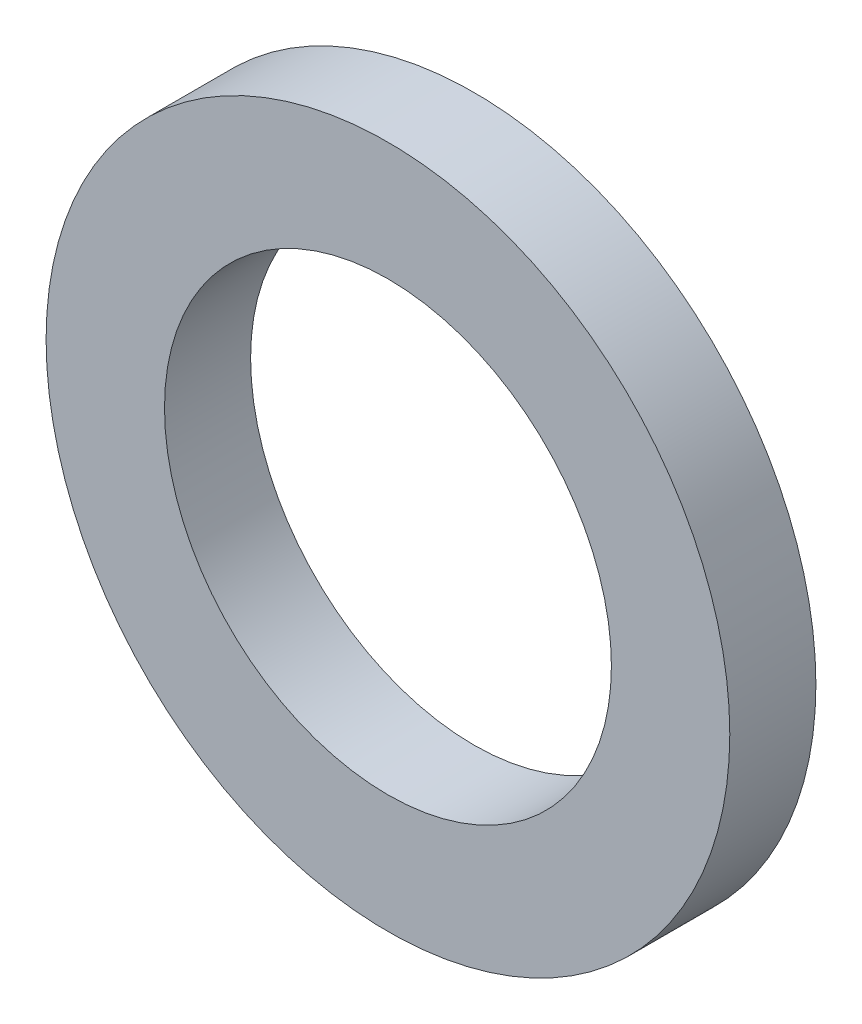
ISO-10303-21;
HEADER;
FILE_DESCRIPTION(('STEP AP214'),'2;1');
FILE_NAME('part.step','',(''),(''),'','','');
FILE_SCHEMA(('AUTOMOTIVE_DESIGN { 1 0 10303 214 1 1 1 1 }'));
ENDSEC;
DATA;
#1=APPLICATION_CONTEXT('core data for automotive mechanical design processes');
#2=APPLICATION_PROTOCOL_DEFINITION('international standard','automotive_design',2000,#1);
#3=PRODUCT_CONTEXT('',#1,'mechanical');
#4=PRODUCT('Part','Part','',(#3));
#5=PRODUCT_RELATED_PRODUCT_CATEGORY('part','',(#4));
#6=PRODUCT_DEFINITION_FORMATION('','',#4);
#7=PRODUCT_DEFINITION_CONTEXT('part definition',#1,'design');
#8=PRODUCT_DEFINITION('design','',#6,#7);
#9=PRODUCT_DEFINITION_SHAPE('','',#8);
#10=(LENGTH_UNIT() NAMED_UNIT(*) SI_UNIT(.MILLI.,.METRE.));
#11=(NAMED_UNIT(*) PLANE_ANGLE_UNIT() SI_UNIT($,.RADIAN.));
#12=(NAMED_UNIT(*) SI_UNIT($,.STERADIAN.) SOLID_ANGLE_UNIT());
#13=UNCERTAINTY_MEASURE_WITH_UNIT(LENGTH_MEASURE(1.E-05),#10,'distance_accuracy_value','');
#14=(GEOMETRIC_REPRESENTATION_CONTEXT(3) GLOBAL_UNCERTAINTY_ASSIGNED_CONTEXT((#13)) GLOBAL_UNIT_ASSIGNED_CONTEXT((#10,
#11,#12)) REPRESENTATION_CONTEXT('',''));
#15=CARTESIAN_POINT('',(0.,0.,0.));
#16=DIRECTION('',(0.,0.,1.));
#17=DIRECTION('',(1.,0.,0.));
#18=AXIS2_PLACEMENT_3D('',#15,#16,#17);
#19=CARTESIAN_POINT('',(0.,0.,2.));
#20=DIRECTION('',(0.,0.,1.));
#21=DIRECTION('',(1.,0.,0.));
#22=AXIS2_PLACEMENT_3D('',#19,#20,#21);
#23=PLANE('',#22);
#24=CARTESIAN_POINT('',(0.,0.,2.));
#25=DIRECTION('',(0.,0.,1.));
#26=DIRECTION('',(1.,0.,0.));
#27=AXIS2_PLACEMENT_3D('',#24,#25,#26);
#28=CIRCLE('',#27,7.94);
#29=CARTESIAN_POINT('',(7.94,0.,2.));
#30=VERTEX_POINT('',#29);
#31=EDGE_CURVE('E10',#30,#30,#28,.T.);
#32=ORIENTED_EDGE('',*,*,#31,.T.);
#33=EDGE_LOOP('',(#32));
#34=FACE_BOUND('',#33,.T.);
#35=CARTESIAN_POINT('',(0.,0.,2.));
#36=DIRECTION('',(0.,0.,1.));
#37=DIRECTION('',(1.,0.,0.));
#38=AXIS2_PLACEMENT_3D('',#35,#36,#37);
#39=CIRCLE('',#38,5.19);
#40=CARTESIAN_POINT('',(5.19,0.,2.));
#41=VERTEX_POINT('',#40);
#42=EDGE_CURVE('E54',#41,#41,#39,.T.);
#43=ORIENTED_EDGE('',*,*,#42,.F.);
#44=EDGE_LOOP('',(#43));
#45=FACE_BOUND('',#44,.T.);
#46=ADVANCED_FACE('F41',(#34,#45),#23,.T.);
#47=CARTESIAN_POINT('',(0.,0.,0.));
#48=DIRECTION('',(0.,0.,1.));
#49=DIRECTION('',(1.,0.,0.));
#50=AXIS2_PLACEMENT_3D('',#47,#48,#49);
#51=PLANE('',#50);
#52=CARTESIAN_POINT('',(0.,0.,0.));
#53=DIRECTION('',(0.,0.,1.));
#54=DIRECTION('',(1.,0.,0.));
#55=AXIS2_PLACEMENT_3D('',#52,#53,#54);
#56=CIRCLE('',#55,7.94);
#57=CARTESIAN_POINT('',(7.94,0.,0.));
#58=VERTEX_POINT('',#57);
#59=EDGE_CURVE('E45',#58,#58,#56,.T.);
#60=ORIENTED_EDGE('',*,*,#59,.F.);
#61=EDGE_LOOP('',(#60));
#62=FACE_BOUND('',#61,.T.);
#63=CARTESIAN_POINT('',(0.,0.,0.));
#64=DIRECTION('',(0.,0.,1.));
#65=DIRECTION('',(1.,0.,0.));
#66=AXIS2_PLACEMENT_3D('',#63,#64,#65);
#67=CIRCLE('',#66,5.19);
#68=CARTESIAN_POINT('',(5.19,0.,0.));
#69=VERTEX_POINT('',#68);
#70=EDGE_CURVE('E56',#69,#69,#67,.T.);
#71=ORIENTED_EDGE('',*,*,#70,.T.);
#72=EDGE_LOOP('',(#71));
#73=FACE_BOUND('',#72,.T.);
#74=ADVANCED_FACE('F68',(#62,#73),#51,.F.);
#75=CARTESIAN_POINT('',(0.,0.,2.));
#76=DIRECTION('',(0.,0.,-1.));
#77=DIRECTION('',(-1.,0.,0.));
#78=AXIS2_PLACEMENT_3D('',#75,#76,#77);
#79=CYLINDRICAL_SURFACE('',#78,7.94);
#80=ORIENTED_EDGE('',*,*,#31,.F.);
#81=EDGE_LOOP('',(#80));
#82=FACE_BOUND('',#81,.T.);
#83=ORIENTED_EDGE('',*,*,#59,.T.);
#84=EDGE_LOOP('',(#83));
#85=FACE_BOUND('',#84,.T.);
#86=ADVANCED_FACE('F43',(#82,#85),#79,.T.);
#87=CARTESIAN_POINT('',(0.,0.,2.));
#88=DIRECTION('',(0.,0.,-1.));
#89=DIRECTION('',(-1.,0.,0.));
#90=AXIS2_PLACEMENT_3D('',#87,#88,#89);
#91=CYLINDRICAL_SURFACE('',#90,5.19);
#92=ORIENTED_EDGE('',*,*,#42,.T.);
#93=EDGE_LOOP('',(#92));
#94=FACE_BOUND('',#93,.T.);
#95=ORIENTED_EDGE('',*,*,#70,.F.);
#96=EDGE_LOOP('',(#95));
#97=FACE_BOUND('',#96,.T.);
#98=ADVANCED_FACE('F64',(#94,#97),#91,.F.);
#99=CLOSED_SHELL('',(#46,#74,#86,#98));
#100=MANIFOLD_SOLID_BREP('B2',#99);
#101=ADVANCED_BREP_SHAPE_REPRESENTATION('',(#18,#100),#14);
#102=SHAPE_DEFINITION_REPRESENTATION(#9,#101);
ENDSEC;
END-ISO-10303-21;
